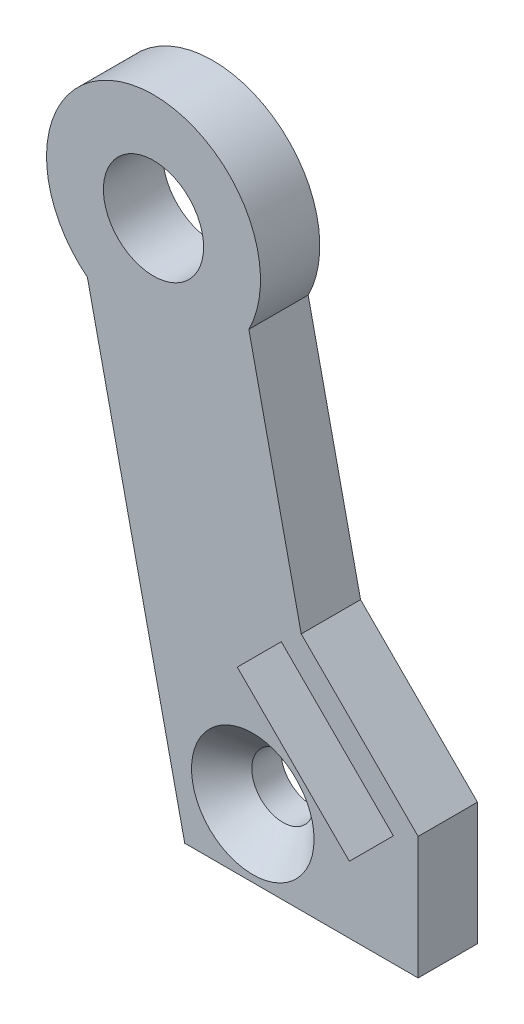
ISO-10303-21;
HEADER;
FILE_DESCRIPTION(('STEP AP214'),'2;1');
FILE_NAME('part.step','',(''),(''),'','','');
FILE_SCHEMA(('AUTOMOTIVE_DESIGN { 1 0 10303 214 1 1 1 1 }'));
ENDSEC;
DATA;
#1=APPLICATION_CONTEXT('core data for automotive mechanical design processes');
#2=APPLICATION_PROTOCOL_DEFINITION('international standard','automotive_design',2000,#1);
#3=PRODUCT_CONTEXT('',#1,'mechanical');
#4=PRODUCT('Part','Part','',(#3));
#5=PRODUCT_RELATED_PRODUCT_CATEGORY('part','',(#4));
#6=PRODUCT_DEFINITION_FORMATION('','',#4);
#7=PRODUCT_DEFINITION_CONTEXT('part definition',#1,'design');
#8=PRODUCT_DEFINITION('design','',#6,#7);
#9=PRODUCT_DEFINITION_SHAPE('','',#8);
#10=(LENGTH_UNIT() NAMED_UNIT(*) SI_UNIT(.MILLI.,.METRE.));
#11=(NAMED_UNIT(*) PLANE_ANGLE_UNIT() SI_UNIT($,.RADIAN.));
#12=(NAMED_UNIT(*) SI_UNIT($,.STERADIAN.) SOLID_ANGLE_UNIT());
#13=UNCERTAINTY_MEASURE_WITH_UNIT(LENGTH_MEASURE(1.E-05),#10,'distance_accuracy_value','');
#14=(GEOMETRIC_REPRESENTATION_CONTEXT(3) GLOBAL_UNCERTAINTY_ASSIGNED_CONTEXT((#13)) GLOBAL_UNIT_ASSIGNED_CONTEXT((#10,
#11,#12)) REPRESENTATION_CONTEXT('',''));
#15=CARTESIAN_POINT('',(0.,0.,0.));
#16=DIRECTION('',(0.,0.,1.));
#17=DIRECTION('',(1.,0.,0.));
#18=AXIS2_PLACEMENT_3D('',#15,#16,#17);
#19=CARTESIAN_POINT('',(8.20970869120796,8.20970869120796,3.05));
#20=DIRECTION('',(0.707106781186548,0.707106781186547,0.));
#21=DIRECTION('',(-0.707106781186547,0.707106781186548,0.));
#22=AXIS2_PLACEMENT_3D('',#19,#20,#21);
#23=PLANE('',#22);
#24=DIRECTION('',(0.707106781186547,-0.707106781186548,0.));
#25=VECTOR('',#24,1.);
#26=CARTESIAN_POINT('',(8.20970869120796,8.20970869120796,0.));
#27=LINE('',#26,#25);
#28=CARTESIAN_POINT('',(4.96428752719385,11.4551298552221,0.));
#29=VERTEX_POINT('',#28);
#30=CARTESIAN_POINT('',(10.7272077938642,5.6922095885517,0.));
#31=VERTEX_POINT('',#30);
#32=EDGE_CURVE('E191',#29,#31,#27,.T.);
#33=ORIENTED_EDGE('',*,*,#32,.T.);
#34=DIRECTION('',(0.,0.,-1.));
#35=VECTOR('',#34,1.);
#36=CARTESIAN_POINT('',(10.7272077938642,5.6922095885517,3.05));
#37=LINE('',#36,#35);
#38=CARTESIAN_POINT('',(10.7272077938642,5.6922095885517,3.05));
#39=VERTEX_POINT('',#38);
#40=EDGE_CURVE('E11',#39,#31,#37,.T.);
#41=ORIENTED_EDGE('',*,*,#40,.F.);
#42=DIRECTION('',(0.707106781186547,-0.707106781186548,0.));
#43=VECTOR('',#42,1.);
#44=CARTESIAN_POINT('',(8.20970869120796,8.20970869120796,3.05));
#45=LINE('',#44,#43);
#46=CARTESIAN_POINT('',(4.96428752719385,11.4551298552221,3.05));
#47=VERTEX_POINT('',#46);
#48=EDGE_CURVE('E150',#47,#39,#45,.T.);
#49=ORIENTED_EDGE('',*,*,#48,.F.);
#50=DIRECTION('',(0.,0.,-1.));
#51=VECTOR('',#50,1.);
#52=CARTESIAN_POINT('',(4.96428752719385,11.4551298552221,3.05));
#53=LINE('',#52,#51);
#54=EDGE_CURVE('E201',#47,#29,#53,.T.);
#55=ORIENTED_EDGE('',*,*,#54,.T.);
#56=EDGE_LOOP('',(#33,#41,#49,#55));
#57=FACE_BOUND('',#56,.T.);
#58=ADVANCED_FACE('F45',(#57),#23,.F.);
#59=CARTESIAN_POINT('',(2.51749910265625,-2.51749910265625,3.05));
#60=DIRECTION('',(-0.707106781186548,0.707106781186548,0.));
#61=DIRECTION('',(-0.707106781186548,-0.707106781186548,0.));
#62=AXIS2_PLACEMENT_3D('',#59,#60,#61);
#63=PLANE('',#62);
#64=DIRECTION('',(0.707106781186548,0.707106781186548,0.));
#65=VECTOR('',#64,1.);
#66=CARTESIAN_POINT('',(2.51749910265625,-2.51749910265625,0.));
#67=LINE('',#66,#65);
#68=CARTESIAN_POINT('',(8.46446609406726,3.42946788875475,0.));
#69=VERTEX_POINT('',#68);
#70=EDGE_CURVE('E140',#69,#31,#67,.T.);
#71=ORIENTED_EDGE('',*,*,#70,.F.);
#72=DIRECTION('',(0.,0.,-1.));
#73=VECTOR('',#72,1.);
#74=CARTESIAN_POINT('',(8.46446609406726,3.42946788875475,3.05));
#75=LINE('',#74,#73);
#76=CARTESIAN_POINT('',(8.46446609406726,3.42946788875475,3.05));
#77=VERTEX_POINT('',#76);
#78=EDGE_CURVE('E56',#77,#69,#75,.T.);
#79=ORIENTED_EDGE('',*,*,#78,.F.);
#80=DIRECTION('',(0.707106781186548,0.707106781186548,0.));
#81=VECTOR('',#80,1.);
#82=CARTESIAN_POINT('',(2.51749910265625,-2.51749910265625,3.05));
#83=LINE('',#82,#81);
#84=EDGE_CURVE('E138',#77,#39,#83,.T.);
#85=ORIENTED_EDGE('',*,*,#84,.T.);
#86=ORIENTED_EDGE('',*,*,#40,.T.);
#87=EDGE_LOOP('',(#71,#79,#85,#86));
#88=FACE_BOUND('',#87,.T.);
#89=ADVANCED_FACE('F136',(#88),#63,.T.);
#90=CARTESIAN_POINT('',(5.94696699141101,5.94696699141101,3.05));
#91=DIRECTION('',(-0.707106781186547,-0.707106781186548,0.));
#92=DIRECTION('',(0.707106781186548,-0.707106781186547,0.));
#93=AXIS2_PLACEMENT_3D('',#90,#91,#92);
#94=PLANE('',#93);
#95=DIRECTION('',(-0.707106781186548,0.707106781186547,0.));
#96=VECTOR('',#95,1.);
#97=CARTESIAN_POINT('',(5.94696699141101,5.94696699141101,0.));
#98=LINE('',#97,#96);
#99=CARTESIAN_POINT('',(2.7015458273969,9.19238815542512,0.));
#100=VERTEX_POINT('',#99);
#101=EDGE_CURVE('E98',#69,#100,#98,.T.);
#102=ORIENTED_EDGE('',*,*,#101,.T.);
#103=DIRECTION('',(0.,0.,-1.));
#104=VECTOR('',#103,1.);
#105=CARTESIAN_POINT('',(2.7015458273969,9.19238815542512,3.05));
#106=LINE('',#105,#104);
#107=CARTESIAN_POINT('',(2.7015458273969,9.19238815542512,3.05));
#108=VERTEX_POINT('',#107);
#109=EDGE_CURVE('E142',#108,#100,#106,.T.);
#110=ORIENTED_EDGE('',*,*,#109,.F.);
#111=DIRECTION('',(-0.707106781186548,0.707106781186547,0.));
#112=VECTOR('',#111,1.);
#113=CARTESIAN_POINT('',(5.94696699141101,5.94696699141101,3.05));
#114=LINE('',#113,#112);
#115=EDGE_CURVE('E144',#77,#108,#114,.T.);
#116=ORIENTED_EDGE('',*,*,#115,.F.);
#117=ORIENTED_EDGE('',*,*,#78,.T.);
#118=EDGE_LOOP('',(#102,#110,#116,#117));
#119=FACE_BOUND('',#118,.T.);
#120=ADVANCED_FACE('F145',(#119),#94,.F.);
#121=CARTESIAN_POINT('',(-1.60499324348538,27.0243390124817,3.05));
#122=DIRECTION('',(0.,0.,-1.));
#123=DIRECTION('',(-1.,0.,0.));
#124=AXIS2_PLACEMENT_3D('',#121,#122,#123);
#125=CYLINDRICAL_SURFACE('',#124,5.5);
#126=CARTESIAN_POINT('',(-1.60499324348538,27.0243390124817,0.));
#127=DIRECTION('',(0.,0.,1.));
#128=DIRECTION('',(1.,0.,0.));
#129=AXIS2_PLACEMENT_3D('',#126,#127,#128);
#130=CIRCLE('',#129,5.5);
#131=CARTESIAN_POINT('',(3.29686868091154,24.5299954767698,0.));
#132=VERTEX_POINT('',#131);
#133=CARTESIAN_POINT('',(-5.00385651819538,22.7002520059764,0.));
#134=VERTEX_POINT('',#133);
#135=EDGE_CURVE('E162',#132,#134,#130,.T.);
#136=ORIENTED_EDGE('',*,*,#135,.T.);
#137=DIRECTION('',(0.,0.,-1.));
#138=VECTOR('',#137,1.);
#139=CARTESIAN_POINT('',(-5.00385651819538,22.7002520059764,3.05));
#140=LINE('',#139,#138);
#141=CARTESIAN_POINT('',(-5.00385651819538,22.7002520059764,3.05));
#142=VERTEX_POINT('',#141);
#143=EDGE_CURVE('E49',#142,#134,#140,.T.);
#144=ORIENTED_EDGE('',*,*,#143,.F.);
#145=CARTESIAN_POINT('',(-1.60499324348538,27.0243390124817,3.05));
#146=DIRECTION('',(0.,0.,1.));
#147=DIRECTION('',(1.,0.,0.));
#148=AXIS2_PLACEMENT_3D('',#145,#146,#147);
#149=CIRCLE('',#148,5.5);
#150=CARTESIAN_POINT('',(3.29686868091154,24.5299954767698,3.05));
#151=VERTEX_POINT('',#150);
#152=EDGE_CURVE('E113',#151,#142,#149,.T.);
#153=ORIENTED_EDGE('',*,*,#152,.F.);
#154=DIRECTION('',(0.,0.,-1.));
#155=VECTOR('',#154,1.);
#156=CARTESIAN_POINT('',(3.29686868091154,24.5299954767698,3.05));
#157=LINE('',#156,#155);
#158=EDGE_CURVE('E161',#151,#132,#157,.T.);
#159=ORIENTED_EDGE('',*,*,#158,.T.);
#160=EDGE_LOOP('',(#136,#144,#153,#159));
#161=FACE_BOUND('',#160,.T.);
#162=ADVANCED_FACE('F47',(#161),#125,.T.);
#163=CARTESIAN_POINT('',(0.,0.,3.05));
#164=DIRECTION('',(-0.976555905777287,-0.215263937740399,0.));
#165=DIRECTION('',(0.215263937740399,-0.976555905777287,0.));
#166=AXIS2_PLACEMENT_3D('',#163,#164,#165);
#167=PLANE('',#166);
#168=DIRECTION('',(-0.215263937740399,0.976555905777287,0.));
#169=VECTOR('',#168,1.);
#170=CARTESIAN_POINT('',(0.,0.,0.));
#171=LINE('',#170,#169);
#172=CARTESIAN_POINT('',(0.,0.,0.));
#173=VERTEX_POINT('',#172);
#174=EDGE_CURVE('E166',#173,#134,#171,.T.);
#175=ORIENTED_EDGE('',*,*,#174,.F.);
#176=DIRECTION('',(0.,0.,-1.));
#177=VECTOR('',#176,1.);
#178=CARTESIAN_POINT('',(0.,0.,3.05));
#179=LINE('',#178,#177);
#180=CARTESIAN_POINT('',(0.,0.,3.05));
#181=VERTEX_POINT('',#180);
#182=EDGE_CURVE('E216',#181,#173,#179,.T.);
#183=ORIENTED_EDGE('',*,*,#182,.F.);
#184=DIRECTION('',(-0.215263937740399,0.976555905777287,0.));
#185=VECTOR('',#184,1.);
#186=CARTESIAN_POINT('',(0.,0.,3.05));
#187=LINE('',#186,#185);
#188=EDGE_CURVE('E226',#181,#142,#187,.T.);
#189=ORIENTED_EDGE('',*,*,#188,.T.);
#190=ORIENTED_EDGE('',*,*,#143,.T.);
#191=EDGE_LOOP('',(#175,#183,#189,#190));
#192=FACE_BOUND('',#191,.T.);
#193=ADVANCED_FACE('F225',(#192),#167,.T.);
#194=CARTESIAN_POINT('',(0.,0.,3.05));
#195=DIRECTION('',(0.,1.,0.));
#196=DIRECTION('',(0.,0.,1.));
#197=AXIS2_PLACEMENT_3D('',#194,#195,#196);
#198=PLANE('',#197);
#199=DIRECTION('',(1.,0.,0.));
#200=VECTOR('',#199,1.);
#201=CARTESIAN_POINT('',(0.,0.,0.));
#202=LINE('',#201,#200);
#203=CARTESIAN_POINT('',(12.,0.,0.));
#204=VERTEX_POINT('',#203);
#205=EDGE_CURVE('E171',#173,#204,#202,.T.);
#206=ORIENTED_EDGE('',*,*,#205,.T.);
#207=DIRECTION('',(0.,0.,-1.));
#208=VECTOR('',#207,1.);
#209=CARTESIAN_POINT('',(12.,0.,3.05));
#210=LINE('',#209,#208);
#211=CARTESIAN_POINT('',(12.,0.,3.05));
#212=VERTEX_POINT('',#211);
#213=EDGE_CURVE('E214',#212,#204,#210,.T.);
#214=ORIENTED_EDGE('',*,*,#213,.F.);
#215=DIRECTION('',(1.,0.,0.));
#216=VECTOR('',#215,1.);
#217=CARTESIAN_POINT('',(0.,0.,3.05));
#218=LINE('',#217,#216);
#219=EDGE_CURVE('E237',#181,#212,#218,.T.);
#220=ORIENTED_EDGE('',*,*,#219,.F.);
#221=ORIENTED_EDGE('',*,*,#182,.T.);
#222=EDGE_LOOP('',(#206,#214,#220,#221));
#223=FACE_BOUND('',#222,.T.);
#224=ADVANCED_FACE('F235',(#223),#198,.F.);
#225=CARTESIAN_POINT('',(12.,0.,3.05));
#226=DIRECTION('',(1.,0.,0.));
#227=DIRECTION('',(0.,0.,-1.));
#228=AXIS2_PLACEMENT_3D('',#225,#226,#227);
#229=PLANE('',#228);
#230=DIRECTION('',(0.,-1.,0.));
#231=VECTOR('',#230,1.);
#232=CARTESIAN_POINT('',(12.,0.,0.));
#233=LINE('',#232,#231);
#234=CARTESIAN_POINT('',(12.,6.3039086153561,0.));
#235=VERTEX_POINT('',#234);
#236=EDGE_CURVE('E175',#235,#204,#233,.T.);
#237=ORIENTED_EDGE('',*,*,#236,.F.);
#238=DIRECTION('',(0.,0.,-1.));
#239=VECTOR('',#238,1.);
#240=CARTESIAN_POINT('',(12.,6.3039086153561,3.05));
#241=LINE('',#240,#239);
#242=CARTESIAN_POINT('',(12.,6.3039086153561,3.05));
#243=VERTEX_POINT('',#242);
#244=EDGE_CURVE('E211',#243,#235,#241,.T.);
#245=ORIENTED_EDGE('',*,*,#244,.F.);
#246=DIRECTION('',(0.,-1.,0.));
#247=VECTOR('',#246,1.);
#248=CARTESIAN_POINT('',(12.,0.,3.05));
#249=LINE('',#248,#247);
#250=EDGE_CURVE('E240',#243,#212,#249,.T.);
#251=ORIENTED_EDGE('',*,*,#250,.T.);
#252=ORIENTED_EDGE('',*,*,#213,.T.);
#253=EDGE_LOOP('',(#237,#245,#251,#252));
#254=FACE_BOUND('',#253,.T.);
#255=ADVANCED_FACE('F241',(#254),#229,.T.);
#256=CARTESIAN_POINT('',(9.15195430767805,9.15195430767805,3.05));
#257=DIRECTION('',(0.707106781186548,0.707106781186548,0.));
#258=DIRECTION('',(-0.707106781186548,0.707106781186548,0.));
#259=AXIS2_PLACEMENT_3D('',#256,#257,#258);
#260=PLANE('',#259);
#261=DIRECTION('',(0.707106781186548,-0.707106781186548,0.));
#262=VECTOR('',#261,1.);
#263=CARTESIAN_POINT('',(9.15195430767805,9.15195430767805,0.));
#264=LINE('',#263,#262);
#265=CARTESIAN_POINT('',(5.98959235991435,12.3143162554418,0.));
#266=VERTEX_POINT('',#265);
#267=EDGE_CURVE('E179',#266,#235,#264,.T.);
#268=ORIENTED_EDGE('',*,*,#267,.F.);
#269=DIRECTION('',(0.,0.,-1.));
#270=VECTOR('',#269,1.);
#271=CARTESIAN_POINT('',(5.98959235991435,12.3143162554418,3.05));
#272=LINE('',#271,#270);
#273=CARTESIAN_POINT('',(5.98959235991435,12.3143162554418,3.05));
#274=VERTEX_POINT('',#273);
#275=EDGE_CURVE('E208',#274,#266,#272,.T.);
#276=ORIENTED_EDGE('',*,*,#275,.F.);
#277=DIRECTION('',(0.707106781186548,-0.707106781186548,0.));
#278=VECTOR('',#277,1.);
#279=CARTESIAN_POINT('',(9.15195430767805,9.15195430767805,3.05));
#280=LINE('',#279,#278);
#281=EDGE_CURVE('E245',#274,#243,#280,.T.);
#282=ORIENTED_EDGE('',*,*,#281,.T.);
#283=ORIENTED_EDGE('',*,*,#244,.T.);
#284=EDGE_LOOP('',(#268,#276,#282,#283));
#285=FACE_BOUND('',#284,.T.);
#286=ADVANCED_FACE('F290',(#285),#260,.T.);
#287=CARTESIAN_POINT('',(-3.24542116401411,3.24542116401411,3.05));
#288=DIRECTION('',(-0.707106781186548,0.707106781186547,0.));
#289=DIRECTION('',(-0.707106781186547,-0.707106781186548,0.));
#290=AXIS2_PLACEMENT_3D('',#287,#288,#289);
#291=PLANE('',#290);
#292=DIRECTION('',(0.707106781186547,0.707106781186548,0.));
#293=VECTOR('',#292,1.);
#294=CARTESIAN_POINT('',(-3.24542116401411,3.24542116401411,0.));
#295=LINE('',#294,#293);
#296=EDGE_CURVE('E104',#100,#29,#295,.T.);
#297=ORIENTED_EDGE('',*,*,#296,.T.);
#298=ORIENTED_EDGE('',*,*,#54,.F.);
#299=DIRECTION('',(0.707106781186547,0.707106781186548,0.));
#300=VECTOR('',#299,1.);
#301=CARTESIAN_POINT('',(-3.24542116401411,3.24542116401411,3.05));
#302=LINE('',#301,#300);
#303=EDGE_CURVE('E65',#108,#47,#302,.T.);
#304=ORIENTED_EDGE('',*,*,#303,.F.);
#305=ORIENTED_EDGE('',*,*,#109,.T.);
#306=EDGE_LOOP('',(#297,#298,#304,#305));
#307=FACE_BOUND('',#306,.T.);
#308=ADVANCED_FACE('F288',(#307),#291,.F.);
#309=CARTESIAN_POINT('',(-1.60499324348538,27.0243390124817,3.05));
#310=DIRECTION('',(0.,0.,-1.));
#311=DIRECTION('',(-1.,0.,0.));
#312=AXIS2_PLACEMENT_3D('',#309,#310,#311);
#313=CYLINDRICAL_SURFACE('',#312,2.575);
#314=CARTESIAN_POINT('',(-1.60499324348538,27.0243390124817,3.05));
#315=DIRECTION('',(0.,0.,1.));
#316=DIRECTION('',(1.,0.,0.));
#317=AXIS2_PLACEMENT_3D('',#314,#315,#316);
#318=CIRCLE('',#317,2.575);
#319=CARTESIAN_POINT('',(0.970006756514625,27.0243390124817,3.05));
#320=VERTEX_POINT('',#319);
#321=EDGE_CURVE('E155',#320,#320,#318,.T.);
#322=ORIENTED_EDGE('',*,*,#321,.T.);
#323=EDGE_LOOP('',(#322));
#324=FACE_BOUND('',#323,.T.);
#325=CARTESIAN_POINT('',(-1.60499324348538,27.0243390124817,0.));
#326=DIRECTION('',(0.,0.,1.));
#327=DIRECTION('',(1.,0.,0.));
#328=AXIS2_PLACEMENT_3D('',#325,#326,#327);
#329=CIRCLE('',#328,2.575);
#330=CARTESIAN_POINT('',(0.970006756514625,27.0243390124817,0.));
#331=VERTEX_POINT('',#330);
#332=EDGE_CURVE('E187',#331,#331,#329,.T.);
#333=ORIENTED_EDGE('',*,*,#332,.F.);
#334=EDGE_LOOP('',(#333));
#335=FACE_BOUND('',#334,.T.);
#336=ADVANCED_FACE('F260',(#324,#335),#313,.F.);
#337=CARTESIAN_POINT('',(8.30072519910674,1.82974347079327,3.05));
#338=DIRECTION('',(0.976555905777289,0.215263937740391,0.));
#339=DIRECTION('',(-0.215263937740391,0.976555905777289,0.));
#340=AXIS2_PLACEMENT_3D('',#337,#338,#339);
#341=PLANE('',#340);
#342=DIRECTION('',(0.215263937740391,-0.976555905777289,0.));
#343=VECTOR('',#342,1.);
#344=CARTESIAN_POINT('',(8.30072519910674,1.82974347079327,0.));
#345=LINE('',#344,#343);
#346=EDGE_CURVE('E183',#132,#266,#345,.T.);
#347=ORIENTED_EDGE('',*,*,#346,.F.);
#348=ORIENTED_EDGE('',*,*,#158,.F.);
#349=DIRECTION('',(0.215263937740391,-0.976555905777289,0.));
#350=VECTOR('',#349,1.);
#351=CARTESIAN_POINT('',(8.30072519910674,1.82974347079327,3.05));
#352=LINE('',#351,#350);
#353=EDGE_CURVE('E249',#151,#274,#352,.T.);
#354=ORIENTED_EDGE('',*,*,#353,.T.);
#355=ORIENTED_EDGE('',*,*,#275,.T.);
#356=EDGE_LOOP('',(#347,#348,#354,#355));
#357=FACE_BOUND('',#356,.T.);
#358=ADVANCED_FACE('F264',(#357),#341,.T.);
#359=CARTESIAN_POINT('',(0.,0.,3.05));
#360=DIRECTION('',(0.,0.,1.));
#361=DIRECTION('',(1.,0.,0.));
#362=AXIS2_PLACEMENT_3D('',#359,#360,#361);
#363=PLANE('',#362);
#364=CARTESIAN_POINT('',(3.5,3.5,3.05));
#365=DIRECTION('',(0.,0.,1.));
#366=DIRECTION('',(1.,0.,0.));
#367=AXIS2_PLACEMENT_3D('',#364,#365,#366);
#368=CIRCLE('',#367,3.15);
#369=CARTESIAN_POINT('',(6.65,3.5,3.05));
#370=VERTEX_POINT('',#369);
#371=EDGE_CURVE('E468',#370,#370,#368,.T.);
#372=ORIENTED_EDGE('',*,*,#371,.F.);
#373=EDGE_LOOP('',(#372));
#374=FACE_BOUND('',#373,.T.);
#375=ORIENTED_EDGE('',*,*,#152,.T.);
#376=ORIENTED_EDGE('',*,*,#188,.F.);
#377=ORIENTED_EDGE('',*,*,#219,.T.);
#378=ORIENTED_EDGE('',*,*,#250,.F.);
#379=ORIENTED_EDGE('',*,*,#281,.F.);
#380=ORIENTED_EDGE('',*,*,#353,.F.);
#381=EDGE_LOOP('',(#375,#376,#377,#378,#379,#380));
#382=FACE_BOUND('',#381,.T.);
#383=ORIENTED_EDGE('',*,*,#321,.F.);
#384=EDGE_LOOP('',(#383));
#385=FACE_BOUND('',#384,.T.);
#386=ORIENTED_EDGE('',*,*,#48,.T.);
#387=ORIENTED_EDGE('',*,*,#84,.F.);
#388=ORIENTED_EDGE('',*,*,#115,.T.);
#389=ORIENTED_EDGE('',*,*,#303,.T.);
#390=EDGE_LOOP('',(#386,#387,#388,#389));
#391=FACE_BOUND('',#390,.T.);
#392=ADVANCED_FACE('F148',(#374,#382,#385,#391),#363,.T.);
#393=CARTESIAN_POINT('',(0.,0.,0.));
#394=DIRECTION('',(0.,0.,1.));
#395=DIRECTION('',(1.,0.,0.));
#396=AXIS2_PLACEMENT_3D('',#393,#394,#395);
#397=PLANE('',#396);
#398=CARTESIAN_POINT('',(3.5,3.5,0.));
#399=DIRECTION('',(0.,0.,1.));
#400=DIRECTION('',(1.,0.,0.));
#401=AXIS2_PLACEMENT_3D('',#398,#399,#400);
#402=CIRCLE('',#401,1.6);
#403=CARTESIAN_POINT('',(5.1,3.5,0.));
#404=VERTEX_POINT('',#403);
#405=EDGE_CURVE('E167',#404,#404,#402,.T.);
#406=ORIENTED_EDGE('',*,*,#405,.T.);
#407=EDGE_LOOP('',(#406));
#408=FACE_BOUND('',#407,.T.);
#409=ORIENTED_EDGE('',*,*,#135,.F.);
#410=ORIENTED_EDGE('',*,*,#346,.T.);
#411=ORIENTED_EDGE('',*,*,#267,.T.);
#412=ORIENTED_EDGE('',*,*,#236,.T.);
#413=ORIENTED_EDGE('',*,*,#205,.F.);
#414=ORIENTED_EDGE('',*,*,#174,.T.);
#415=EDGE_LOOP('',(#409,#410,#411,#412,#413,#414));
#416=FACE_BOUND('',#415,.T.);
#417=ORIENTED_EDGE('',*,*,#332,.T.);
#418=EDGE_LOOP('',(#417));
#419=FACE_BOUND('',#418,.T.);
#420=ORIENTED_EDGE('',*,*,#32,.F.);
#421=ORIENTED_EDGE('',*,*,#296,.F.);
#422=ORIENTED_EDGE('',*,*,#101,.F.);
#423=ORIENTED_EDGE('',*,*,#70,.T.);
#424=EDGE_LOOP('',(#420,#421,#422,#423));
#425=FACE_BOUND('',#424,.T.);
#426=ADVANCED_FACE('F231',(#408,#416,#419,#425),#397,.F.);
#427=CARTESIAN_POINT('',(3.5,3.5,3.05));
#428=DIRECTION('',(0.,0.,1.));
#429=DIRECTION('',(1.,0.,0.));
#430=AXIS2_PLACEMENT_3D('',#427,#428,#429);
#431=CYLINDRICAL_SURFACE('',#430,1.6);
#432=ORIENTED_EDGE('',*,*,#405,.F.);
#433=EDGE_LOOP('',(#432));
#434=FACE_BOUND('',#433,.T.);
#435=CARTESIAN_POINT('',(3.5,3.5,1.5));
#436=DIRECTION('',(0.,0.,1.));
#437=DIRECTION('',(1.,0.,0.));
#438=AXIS2_PLACEMENT_3D('',#435,#436,#437);
#439=CIRCLE('',#438,1.6);
#440=CARTESIAN_POINT('',(5.1,3.5,1.5));
#441=VERTEX_POINT('',#440);
#442=EDGE_CURVE('E466',#441,#441,#439,.T.);
#443=ORIENTED_EDGE('',*,*,#442,.T.);
#444=EDGE_LOOP('',(#443));
#445=FACE_BOUND('',#444,.T.);
#446=ADVANCED_FACE('F271',(#434,#445),#431,.F.);
#447=CARTESIAN_POINT('',(3.5,3.5,3.05));
#448=DIRECTION('',(0.,0.,1.));
#449=DIRECTION('',(1.,0.,0.));
#450=AXIS2_PLACEMENT_3D('',#447,#448,#449);
#451=CONICAL_SURFACE('',#450,3.15,0.785398163397449);
#452=ORIENTED_EDGE('',*,*,#442,.F.);
#453=EDGE_LOOP('',(#452));
#454=FACE_BOUND('',#453,.T.);
#455=ORIENTED_EDGE('',*,*,#371,.T.);
#456=EDGE_LOOP('',(#455));
#457=FACE_BOUND('',#456,.T.);
#458=ADVANCED_FACE('F344',(#454,#457),#451,.F.);
#459=CLOSED_SHELL('',(#58,#89,#120,#162,#193,#224,#255,#286,#308,#336,#358,#392,#426,#446,#458));
#460=MANIFOLD_SOLID_BREP('B2',#459);
#461=ADVANCED_BREP_SHAPE_REPRESENTATION('',(#18,#460),#14);
#462=SHAPE_DEFINITION_REPRESENTATION(#9,#461);
ENDSEC;
END-ISO-10303-21;
